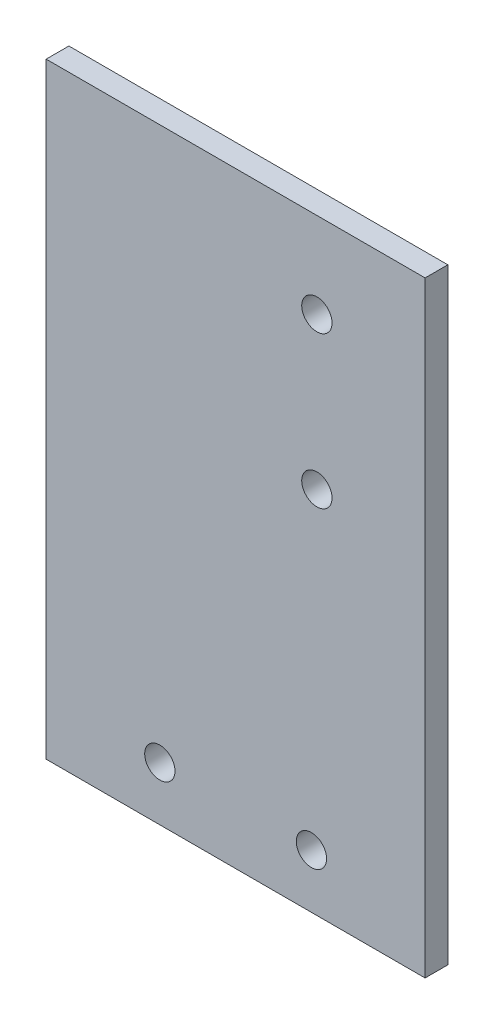
ISO-10303-21;
HEADER;
FILE_DESCRIPTION(('STEP AP214'),'2;1');
FILE_NAME('part.step','',(''),(''),'','','');
FILE_SCHEMA(('AUTOMOTIVE_DESIGN { 1 0 10303 214 1 1 1 1 }'));
ENDSEC;
DATA;
#1=APPLICATION_CONTEXT('core data for automotive mechanical design processes');
#2=APPLICATION_PROTOCOL_DEFINITION('international standard','automotive_design',2000,#1);
#3=PRODUCT_CONTEXT('',#1,'mechanical');
#4=PRODUCT('Part','Part','',(#3));
#5=PRODUCT_RELATED_PRODUCT_CATEGORY('part','',(#4));
#6=PRODUCT_DEFINITION_FORMATION('','',#4);
#7=PRODUCT_DEFINITION_CONTEXT('part definition',#1,'design');
#8=PRODUCT_DEFINITION('design','',#6,#7);
#9=PRODUCT_DEFINITION_SHAPE('','',#8);
#10=(LENGTH_UNIT() NAMED_UNIT(*) SI_UNIT(.MILLI.,.METRE.));
#11=(NAMED_UNIT(*) PLANE_ANGLE_UNIT() SI_UNIT($,.RADIAN.));
#12=(NAMED_UNIT(*) SI_UNIT($,.STERADIAN.) SOLID_ANGLE_UNIT());
#13=UNCERTAINTY_MEASURE_WITH_UNIT(LENGTH_MEASURE(1.E-05),#10,'distance_accuracy_value','');
#14=(GEOMETRIC_REPRESENTATION_CONTEXT(3) GLOBAL_UNCERTAINTY_ASSIGNED_CONTEXT((#13)) GLOBAL_UNIT_ASSIGNED_CONTEXT((#10,
#11,#12)) REPRESENTATION_CONTEXT('',''));
#15=CARTESIAN_POINT('',(0.,0.,0.));
#16=DIRECTION('',(0.,0.,1.));
#17=DIRECTION('',(1.,0.,0.));
#18=AXIS2_PLACEMENT_3D('',#15,#16,#17);
#19=CARTESIAN_POINT('',(0.,0.,1.5));
#20=DIRECTION('',(0.,0.,1.));
#21=DIRECTION('',(1.,0.,0.));
#22=AXIS2_PLACEMENT_3D('',#19,#20,#21);
#23=PLANE('',#22);
#24=CARTESIAN_POINT('',(-7.13999999999526,34.3500000016245,1.5));
#25=DIRECTION('',(0.,0.,1.));
#26=DIRECTION('',(1.,0.,0.));
#27=AXIS2_PLACEMENT_3D('',#24,#25,#26);
#28=CIRCLE('',#27,1.);
#29=CARTESIAN_POINT('',(-6.13999999999526,34.3500000016245,1.5));
#30=VERTEX_POINT('',#29);
#31=EDGE_CURVE('E122',#30,#30,#28,.T.);
#32=ORIENTED_EDGE('',*,*,#31,.F.);
#33=EDGE_LOOP('',(#32));
#34=FACE_BOUND('',#33,.T.);
#35=CARTESIAN_POINT('',(-17.5000000000324,3.56000000162451,1.5));
#36=DIRECTION('',(0.,0.,1.));
#37=DIRECTION('',(1.,0.,0.));
#38=AXIS2_PLACEMENT_3D('',#35,#36,#37);
#39=CIRCLE('',#38,1.);
#40=CARTESIAN_POINT('',(-16.5000000000324,3.56000000162451,1.5));
#41=VERTEX_POINT('',#40);
#42=EDGE_CURVE('E101',#41,#41,#39,.T.);
#43=ORIENTED_EDGE('',*,*,#42,.F.);
#44=EDGE_LOOP('',(#43));
#45=FACE_BOUND('',#44,.T.);
#46=DIRECTION('',(-1.,0.,0.));
#47=VECTOR('',#46,1.);
#48=CARTESIAN_POINT('',(0.,40.,1.5));
#49=LINE('',#48,#47);
#50=CARTESIAN_POINT('',(0.,40.,1.5));
#51=VERTEX_POINT('',#50);
#52=CARTESIAN_POINT('',(-25.,40.,1.5));
#53=VERTEX_POINT('',#52);
#54=EDGE_CURVE('E86',#51,#53,#49,.T.);
#55=ORIENTED_EDGE('',*,*,#54,.T.);
#56=DIRECTION('',(0.,-1.,0.));
#57=VECTOR('',#56,1.);
#58=CARTESIAN_POINT('',(-25.,40.,1.5));
#59=LINE('',#58,#57);
#60=CARTESIAN_POINT('',(-25.,0.,1.5));
#61=VERTEX_POINT('',#60);
#62=EDGE_CURVE('E81',#53,#61,#59,.T.);
#63=ORIENTED_EDGE('',*,*,#62,.T.);
#64=DIRECTION('',(1.,0.,0.));
#65=VECTOR('',#64,1.);
#66=CARTESIAN_POINT('',(-25.,0.,1.5));
#67=LINE('',#66,#65);
#68=CARTESIAN_POINT('',(0.,0.,1.5));
#69=VERTEX_POINT('',#68);
#70=EDGE_CURVE('E84',#61,#69,#67,.T.);
#71=ORIENTED_EDGE('',*,*,#70,.T.);
#72=DIRECTION('',(0.,1.,0.));
#73=VECTOR('',#72,1.);
#74=CARTESIAN_POINT('',(0.,0.,1.5));
#75=LINE('',#74,#73);
#76=EDGE_CURVE('E51',#69,#51,#75,.T.);
#77=ORIENTED_EDGE('',*,*,#76,.T.);
#78=EDGE_LOOP('',(#55,#63,#71,#77));
#79=FACE_BOUND('',#78,.T.);
#80=CARTESIAN_POINT('',(-7.50000000003236,3.56000000162452,1.5));
#81=DIRECTION('',(0.,0.,1.));
#82=DIRECTION('',(1.,0.,0.));
#83=AXIS2_PLACEMENT_3D('',#80,#81,#82);
#84=CIRCLE('',#83,1.);
#85=CARTESIAN_POINT('',(-6.50000000003236,3.56000000162452,1.5));
#86=VERTEX_POINT('',#85);
#87=EDGE_CURVE('E116',#86,#86,#84,.T.);
#88=ORIENTED_EDGE('',*,*,#87,.F.);
#89=EDGE_LOOP('',(#88));
#90=FACE_BOUND('',#89,.T.);
#91=CARTESIAN_POINT('',(-7.13999999999526,24.3500000016245,1.5));
#92=DIRECTION('',(0.,0.,1.));
#93=DIRECTION('',(1.,0.,0.));
#94=AXIS2_PLACEMENT_3D('',#91,#92,#93);
#95=CIRCLE('',#94,1.);
#96=CARTESIAN_POINT('',(-6.13999999999526,24.3500000016245,1.5));
#97=VERTEX_POINT('',#96);
#98=EDGE_CURVE('E128',#97,#97,#95,.T.);
#99=ORIENTED_EDGE('',*,*,#98,.F.);
#100=EDGE_LOOP('',(#99));
#101=FACE_BOUND('',#100,.T.);
#102=ADVANCED_FACE('F34',(#34,#45,#79,#90,#101),#23,.T.);
#103=CARTESIAN_POINT('',(0.,0.,0.));
#104=DIRECTION('',(0.,0.,1.));
#105=DIRECTION('',(1.,0.,0.));
#106=AXIS2_PLACEMENT_3D('',#103,#104,#105);
#107=PLANE('',#106);
#108=DIRECTION('',(-1.,0.,0.));
#109=VECTOR('',#108,1.);
#110=CARTESIAN_POINT('',(0.,40.,0.));
#111=LINE('',#110,#109);
#112=CARTESIAN_POINT('',(0.,40.,0.));
#113=VERTEX_POINT('',#112);
#114=CARTESIAN_POINT('',(-25.,40.,0.));
#115=VERTEX_POINT('',#114);
#116=EDGE_CURVE('E98',#113,#115,#111,.T.);
#117=ORIENTED_EDGE('',*,*,#116,.F.);
#118=DIRECTION('',(0.,1.,0.));
#119=VECTOR('',#118,1.);
#120=CARTESIAN_POINT('',(0.,0.,0.));
#121=LINE('',#120,#119);
#122=CARTESIAN_POINT('',(0.,0.,0.));
#123=VERTEX_POINT('',#122);
#124=EDGE_CURVE('E74',#123,#113,#121,.T.);
#125=ORIENTED_EDGE('',*,*,#124,.F.);
#126=DIRECTION('',(1.,0.,0.));
#127=VECTOR('',#126,1.);
#128=CARTESIAN_POINT('',(-25.,0.,0.));
#129=LINE('',#128,#127);
#130=CARTESIAN_POINT('',(-25.,0.,0.));
#131=VERTEX_POINT('',#130);
#132=EDGE_CURVE('E68',#131,#123,#129,.T.);
#133=ORIENTED_EDGE('',*,*,#132,.F.);
#134=DIRECTION('',(0.,-1.,0.));
#135=VECTOR('',#134,1.);
#136=CARTESIAN_POINT('',(-25.,40.,0.));
#137=LINE('',#136,#135);
#138=EDGE_CURVE('E90',#115,#131,#137,.T.);
#139=ORIENTED_EDGE('',*,*,#138,.F.);
#140=EDGE_LOOP('',(#117,#125,#133,#139));
#141=FACE_BOUND('',#140,.T.);
#142=CARTESIAN_POINT('',(-17.5000000000324,3.56000000162451,0.));
#143=DIRECTION('',(0.,0.,1.));
#144=DIRECTION('',(1.,0.,0.));
#145=AXIS2_PLACEMENT_3D('',#142,#143,#144);
#146=CIRCLE('',#145,1.);
#147=CARTESIAN_POINT('',(-16.5000000000324,3.56000000162451,0.));
#148=VERTEX_POINT('',#147);
#149=EDGE_CURVE('E113',#148,#148,#146,.T.);
#150=ORIENTED_EDGE('',*,*,#149,.T.);
#151=EDGE_LOOP('',(#150));
#152=FACE_BOUND('',#151,.T.);
#153=CARTESIAN_POINT('',(-7.50000000003236,3.56000000162452,0.));
#154=DIRECTION('',(0.,0.,1.));
#155=DIRECTION('',(1.,0.,0.));
#156=AXIS2_PLACEMENT_3D('',#153,#154,#155);
#157=CIRCLE('',#156,1.);
#158=CARTESIAN_POINT('',(-6.50000000003236,3.56000000162452,0.));
#159=VERTEX_POINT('',#158);
#160=EDGE_CURVE('E119',#159,#159,#157,.T.);
#161=ORIENTED_EDGE('',*,*,#160,.T.);
#162=EDGE_LOOP('',(#161));
#163=FACE_BOUND('',#162,.T.);
#164=CARTESIAN_POINT('',(-7.13999999999526,34.3500000016245,0.));
#165=DIRECTION('',(0.,0.,1.));
#166=DIRECTION('',(1.,0.,0.));
#167=AXIS2_PLACEMENT_3D('',#164,#165,#166);
#168=CIRCLE('',#167,1.);
#169=CARTESIAN_POINT('',(-6.13999999999526,34.3500000016245,0.));
#170=VERTEX_POINT('',#169);
#171=EDGE_CURVE('E125',#170,#170,#168,.T.);
#172=ORIENTED_EDGE('',*,*,#171,.T.);
#173=EDGE_LOOP('',(#172));
#174=FACE_BOUND('',#173,.T.);
#175=CARTESIAN_POINT('',(-7.13999999999526,24.3500000016245,0.));
#176=DIRECTION('',(0.,0.,1.));
#177=DIRECTION('',(1.,0.,0.));
#178=AXIS2_PLACEMENT_3D('',#175,#176,#177);
#179=CIRCLE('',#178,1.);
#180=CARTESIAN_POINT('',(-6.13999999999526,24.3500000016245,0.));
#181=VERTEX_POINT('',#180);
#182=EDGE_CURVE('E131',#181,#181,#179,.T.);
#183=ORIENTED_EDGE('',*,*,#182,.T.);
#184=EDGE_LOOP('',(#183));
#185=FACE_BOUND('',#184,.T.);
#186=ADVANCED_FACE('F109',(#141,#152,#163,#174,#185),#107,.F.);
#187=CARTESIAN_POINT('',(0.,40.,1.5));
#188=DIRECTION('',(0.,-1.,0.));
#189=DIRECTION('',(1.,0.,0.));
#190=AXIS2_PLACEMENT_3D('',#187,#188,#189);
#191=PLANE('',#190);
#192=ORIENTED_EDGE('',*,*,#116,.T.);
#193=DIRECTION('',(0.,0.,-1.));
#194=VECTOR('',#193,1.);
#195=CARTESIAN_POINT('',(-25.,40.,1.5));
#196=LINE('',#195,#194);
#197=EDGE_CURVE('E11',#53,#115,#196,.T.);
#198=ORIENTED_EDGE('',*,*,#197,.F.);
#199=ORIENTED_EDGE('',*,*,#54,.F.);
#200=DIRECTION('',(0.,0.,-1.));
#201=VECTOR('',#200,1.);
#202=CARTESIAN_POINT('',(0.,40.,1.5));
#203=LINE('',#202,#201);
#204=EDGE_CURVE('E94',#51,#113,#203,.T.);
#205=ORIENTED_EDGE('',*,*,#204,.T.);
#206=EDGE_LOOP('',(#192,#198,#199,#205));
#207=FACE_BOUND('',#206,.T.);
#208=ADVANCED_FACE('F36',(#207),#191,.F.);
#209=CARTESIAN_POINT('',(-25.,40.,1.5));
#210=DIRECTION('',(1.,0.,0.));
#211=DIRECTION('',(0.,1.,0.));
#212=AXIS2_PLACEMENT_3D('',#209,#210,#211);
#213=PLANE('',#212);
#214=ORIENTED_EDGE('',*,*,#138,.T.);
#215=DIRECTION('',(0.,0.,-1.));
#216=VECTOR('',#215,1.);
#217=CARTESIAN_POINT('',(-25.,0.,1.5));
#218=LINE('',#217,#216);
#219=EDGE_CURVE('E43',#61,#131,#218,.T.);
#220=ORIENTED_EDGE('',*,*,#219,.F.);
#221=ORIENTED_EDGE('',*,*,#62,.F.);
#222=ORIENTED_EDGE('',*,*,#197,.T.);
#223=EDGE_LOOP('',(#214,#220,#221,#222));
#224=FACE_BOUND('',#223,.T.);
#225=ADVANCED_FACE('F89',(#224),#213,.F.);
#226=CARTESIAN_POINT('',(-25.,0.,1.5));
#227=DIRECTION('',(0.,1.,0.));
#228=DIRECTION('',(0.,0.,1.));
#229=AXIS2_PLACEMENT_3D('',#226,#227,#228);
#230=PLANE('',#229);
#231=ORIENTED_EDGE('',*,*,#132,.T.);
#232=DIRECTION('',(0.,0.,-1.));
#233=VECTOR('',#232,1.);
#234=CARTESIAN_POINT('',(0.,0.,1.5));
#235=LINE('',#234,#233);
#236=EDGE_CURVE('E91',#69,#123,#235,.T.);
#237=ORIENTED_EDGE('',*,*,#236,.F.);
#238=ORIENTED_EDGE('',*,*,#70,.F.);
#239=ORIENTED_EDGE('',*,*,#219,.T.);
#240=EDGE_LOOP('',(#231,#237,#238,#239));
#241=FACE_BOUND('',#240,.T.);
#242=ADVANCED_FACE('F92',(#241),#230,.F.);
#243=CARTESIAN_POINT('',(0.,0.,1.5));
#244=DIRECTION('',(-1.,0.,0.));
#245=DIRECTION('',(0.,-1.,0.));
#246=AXIS2_PLACEMENT_3D('',#243,#244,#245);
#247=PLANE('',#246);
#248=ORIENTED_EDGE('',*,*,#124,.T.);
#249=ORIENTED_EDGE('',*,*,#204,.F.);
#250=ORIENTED_EDGE('',*,*,#76,.F.);
#251=ORIENTED_EDGE('',*,*,#236,.T.);
#252=EDGE_LOOP('',(#248,#249,#250,#251));
#253=FACE_BOUND('',#252,.T.);
#254=ADVANCED_FACE('F106',(#253),#247,.F.);
#255=CARTESIAN_POINT('',(-17.5000000000324,3.56000000162451,1.5));
#256=DIRECTION('',(0.,0.,-1.));
#257=DIRECTION('',(-1.,0.,0.));
#258=AXIS2_PLACEMENT_3D('',#255,#256,#257);
#259=CYLINDRICAL_SURFACE('',#258,1.);
#260=ORIENTED_EDGE('',*,*,#42,.T.);
#261=EDGE_LOOP('',(#260));
#262=FACE_BOUND('',#261,.T.);
#263=ORIENTED_EDGE('',*,*,#149,.F.);
#264=EDGE_LOOP('',(#263));
#265=FACE_BOUND('',#264,.T.);
#266=ADVANCED_FACE('F150',(#262,#265),#259,.F.);
#267=CARTESIAN_POINT('',(-7.50000000003236,3.56000000162452,1.5));
#268=DIRECTION('',(0.,0.,-1.));
#269=DIRECTION('',(-1.,0.,0.));
#270=AXIS2_PLACEMENT_3D('',#267,#268,#269);
#271=CYLINDRICAL_SURFACE('',#270,1.);
#272=ORIENTED_EDGE('',*,*,#87,.T.);
#273=EDGE_LOOP('',(#272));
#274=FACE_BOUND('',#273,.T.);
#275=ORIENTED_EDGE('',*,*,#160,.F.);
#276=EDGE_LOOP('',(#275));
#277=FACE_BOUND('',#276,.T.);
#278=ADVANCED_FACE('F196',(#274,#277),#271,.F.);
#279=CARTESIAN_POINT('',(-7.13999999999526,34.3500000016245,1.5));
#280=DIRECTION('',(0.,0.,-1.));
#281=DIRECTION('',(-1.,0.,0.));
#282=AXIS2_PLACEMENT_3D('',#279,#280,#281);
#283=CYLINDRICAL_SURFACE('',#282,1.);
#284=ORIENTED_EDGE('',*,*,#31,.T.);
#285=EDGE_LOOP('',(#284));
#286=FACE_BOUND('',#285,.T.);
#287=ORIENTED_EDGE('',*,*,#171,.F.);
#288=EDGE_LOOP('',(#287));
#289=FACE_BOUND('',#288,.T.);
#290=ADVANCED_FACE('F204',(#286,#289),#283,.F.);
#291=CARTESIAN_POINT('',(-7.13999999999526,24.3500000016245,1.5));
#292=DIRECTION('',(0.,0.,-1.));
#293=DIRECTION('',(-1.,0.,0.));
#294=AXIS2_PLACEMENT_3D('',#291,#292,#293);
#295=CYLINDRICAL_SURFACE('',#294,1.);
#296=ORIENTED_EDGE('',*,*,#98,.T.);
#297=EDGE_LOOP('',(#296));
#298=FACE_BOUND('',#297,.T.);
#299=ORIENTED_EDGE('',*,*,#182,.F.);
#300=EDGE_LOOP('',(#299));
#301=FACE_BOUND('',#300,.T.);
#302=ADVANCED_FACE('F137',(#298,#301),#295,.F.);
#303=CLOSED_SHELL('',(#102,#186,#208,#225,#242,#254,#266,#278,#290,#302));
#304=MANIFOLD_SOLID_BREP('B2',#303);
#305=ADVANCED_BREP_SHAPE_REPRESENTATION('',(#18,#304),#14);
#306=SHAPE_DEFINITION_REPRESENTATION(#9,#305);
ENDSEC;
END-ISO-10303-21;
